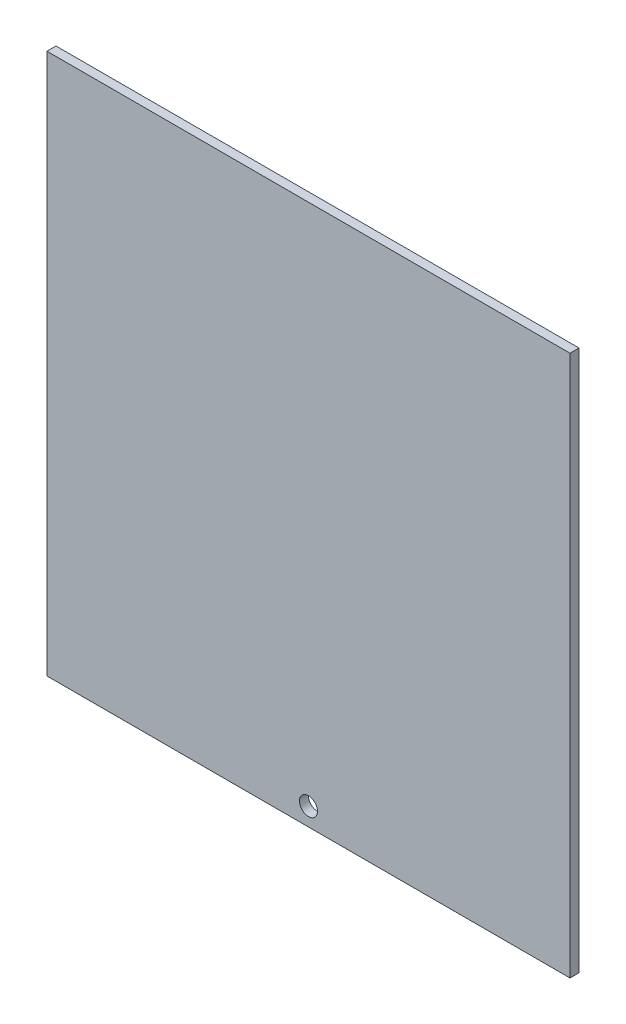
ISO-10303-21;
HEADER;
FILE_DESCRIPTION(('STEP AP214'),'2;1');
FILE_NAME('part.step','',(''),(''),'','','');
FILE_SCHEMA(('AUTOMOTIVE_DESIGN { 1 0 10303 214 1 1 1 1 }'));
ENDSEC;
DATA;
#1=APPLICATION_CONTEXT('core data for automotive mechanical design processes');
#2=APPLICATION_PROTOCOL_DEFINITION('international standard','automotive_design',2000,#1);
#3=PRODUCT_CONTEXT('',#1,'mechanical');
#4=PRODUCT('Part','Part','',(#3));
#5=PRODUCT_RELATED_PRODUCT_CATEGORY('part','',(#4));
#6=PRODUCT_DEFINITION_FORMATION('','',#4);
#7=PRODUCT_DEFINITION_CONTEXT('part definition',#1,'design');
#8=PRODUCT_DEFINITION('design','',#6,#7);
#9=PRODUCT_DEFINITION_SHAPE('','',#8);
#10=(LENGTH_UNIT() NAMED_UNIT(*) SI_UNIT(.MILLI.,.METRE.));
#11=(NAMED_UNIT(*) PLANE_ANGLE_UNIT() SI_UNIT($,.RADIAN.));
#12=(NAMED_UNIT(*) SI_UNIT($,.STERADIAN.) SOLID_ANGLE_UNIT());
#13=UNCERTAINTY_MEASURE_WITH_UNIT(LENGTH_MEASURE(1.E-05),#10,'distance_accuracy_value','');
#14=(GEOMETRIC_REPRESENTATION_CONTEXT(3) GLOBAL_UNCERTAINTY_ASSIGNED_CONTEXT((#13)) GLOBAL_UNIT_ASSIGNED_CONTEXT((#10,
#11,#12)) REPRESENTATION_CONTEXT('',''));
#15=CARTESIAN_POINT('',(0.,0.,0.));
#16=DIRECTION('',(0.,0.,1.));
#17=DIRECTION('',(1.,0.,0.));
#18=AXIS2_PLACEMENT_3D('',#15,#16,#17);
#19=CARTESIAN_POINT('',(0.,0.,0.));
#20=DIRECTION('',(0.,0.,-1.));
#21=DIRECTION('',(-1.,0.,0.));
#22=AXIS2_PLACEMENT_3D('',#19,#20,#21);
#23=PLANE('',#22);
#24=DIRECTION('',(0.,1.,0.));
#25=VECTOR('',#24,1.);
#26=CARTESIAN_POINT('',(290.,0.,0.));
#27=LINE('',#26,#25);
#28=CARTESIAN_POINT('',(290.,300.,0.));
#29=VERTEX_POINT('',#28);
#30=CARTESIAN_POINT('',(290.,0.,0.));
#31=VERTEX_POINT('',#30);
#32=EDGE_CURVE('E55',#29,#31,#27,.F.);
#33=ORIENTED_EDGE('',*,*,#32,.T.);
#34=DIRECTION('',(1.,0.,0.));
#35=VECTOR('',#34,1.);
#36=CARTESIAN_POINT('',(0.,0.,0.));
#37=LINE('',#36,#35);
#38=CARTESIAN_POINT('',(0.,0.,0.));
#39=VERTEX_POINT('',#38);
#40=EDGE_CURVE('E91',#31,#39,#37,.F.);
#41=ORIENTED_EDGE('',*,*,#40,.T.);
#42=DIRECTION('',(0.,1.,0.));
#43=VECTOR('',#42,1.);
#44=CARTESIAN_POINT('',(0.,0.,0.));
#45=LINE('',#44,#43);
#46=CARTESIAN_POINT('',(0.,300.,0.));
#47=VERTEX_POINT('',#46);
#48=EDGE_CURVE('E60',#39,#47,#45,.T.);
#49=ORIENTED_EDGE('',*,*,#48,.T.);
#50=DIRECTION('',(1.,0.,0.));
#51=VECTOR('',#50,1.);
#52=CARTESIAN_POINT('',(0.,300.,0.));
#53=LINE('',#52,#51);
#54=EDGE_CURVE('E58',#47,#29,#53,.T.);
#55=ORIENTED_EDGE('',*,*,#54,.T.);
#56=EDGE_LOOP('',(#33,#41,#49,#55));
#57=FACE_BOUND('',#56,.T.);
#58=CARTESIAN_POINT('',(145.,10.,0.));
#59=DIRECTION('',(0.,0.,1.));
#60=DIRECTION('',(1.,0.,0.));
#61=AXIS2_PLACEMENT_3D('',#58,#59,#60);
#62=CIRCLE('',#61,4.99999999999998);
#63=CARTESIAN_POINT('',(150.,10.,0.));
#64=VERTEX_POINT('',#63);
#65=EDGE_CURVE('E20',#64,#64,#62,.T.);
#66=ORIENTED_EDGE('',*,*,#65,.T.);
#67=EDGE_LOOP('',(#66));
#68=FACE_BOUND('',#67,.T.);
#69=ADVANCED_FACE('F17',(#57,#68),#23,.T.);
#70=CARTESIAN_POINT('',(145.,10.,-5.));
#71=DIRECTION('',(0.,0.,1.));
#72=DIRECTION('',(1.,0.,0.));
#73=AXIS2_PLACEMENT_3D('',#70,#71,#72);
#74=CYLINDRICAL_SURFACE('',#73,4.99999999999998);
#75=ORIENTED_EDGE('',*,*,#65,.F.);
#76=EDGE_LOOP('',(#75));
#77=FACE_BOUND('',#76,.T.);
#78=CARTESIAN_POINT('',(145.,10.,5.));
#79=DIRECTION('',(0.,0.,1.));
#80=DIRECTION('',(1.,0.,0.));
#81=AXIS2_PLACEMENT_3D('',#78,#79,#80);
#82=CIRCLE('',#81,4.99999999999998);
#83=CARTESIAN_POINT('',(150.,10.,5.));
#84=VERTEX_POINT('',#83);
#85=EDGE_CURVE('E79',#84,#84,#82,.T.);
#86=ORIENTED_EDGE('',*,*,#85,.T.);
#87=EDGE_LOOP('',(#86));
#88=FACE_BOUND('',#87,.T.);
#89=ADVANCED_FACE('F114',(#77,#88),#74,.F.);
#90=CARTESIAN_POINT('',(0.,300.,5.));
#91=DIRECTION('',(0.,-1.,0.));
#92=DIRECTION('',(0.,0.,-1.));
#93=AXIS2_PLACEMENT_3D('',#90,#91,#92);
#94=PLANE('',#93);
#95=DIRECTION('',(0.,0.,-1.));
#96=VECTOR('',#95,1.);
#97=CARTESIAN_POINT('',(0.,300.,5.));
#98=LINE('',#97,#96);
#99=CARTESIAN_POINT('',(0.,300.,5.));
#100=VERTEX_POINT('',#99);
#101=EDGE_CURVE('E86',#47,#100,#98,.F.);
#102=ORIENTED_EDGE('',*,*,#101,.T.);
#103=DIRECTION('',(-1.,0.,0.));
#104=VECTOR('',#103,1.);
#105=CARTESIAN_POINT('',(0.,300.,5.));
#106=LINE('',#105,#104);
#107=CARTESIAN_POINT('',(290.,300.,5.));
#108=VERTEX_POINT('',#107);
#109=EDGE_CURVE('E76',#100,#108,#106,.F.);
#110=ORIENTED_EDGE('',*,*,#109,.T.);
#111=DIRECTION('',(0.,0.,1.));
#112=VECTOR('',#111,1.);
#113=CARTESIAN_POINT('',(290.,300.,5.));
#114=LINE('',#113,#112);
#115=EDGE_CURVE('E65',#108,#29,#114,.F.);
#116=ORIENTED_EDGE('',*,*,#115,.T.);
#117=ORIENTED_EDGE('',*,*,#54,.F.);
#118=EDGE_LOOP('',(#102,#110,#116,#117));
#119=FACE_BOUND('',#118,.T.);
#120=ADVANCED_FACE('F75',(#119),#94,.F.);
#121=CARTESIAN_POINT('',(290.,0.,5.));
#122=DIRECTION('',(-1.,0.,0.));
#123=DIRECTION('',(0.,0.,1.));
#124=AXIS2_PLACEMENT_3D('',#121,#122,#123);
#125=PLANE('',#124);
#126=ORIENTED_EDGE('',*,*,#115,.F.);
#127=DIRECTION('',(0.,1.,0.));
#128=VECTOR('',#127,1.);
#129=CARTESIAN_POINT('',(290.,0.,5.));
#130=LINE('',#129,#128);
#131=CARTESIAN_POINT('',(290.,0.,5.));
#132=VERTEX_POINT('',#131);
#133=EDGE_CURVE('E83',#108,#132,#130,.F.);
#134=ORIENTED_EDGE('',*,*,#133,.T.);
#135=DIRECTION('',(0.,0.,1.));
#136=VECTOR('',#135,1.);
#137=CARTESIAN_POINT('',(290.,0.,5.));
#138=LINE('',#137,#136);
#139=EDGE_CURVE('E72',#132,#31,#138,.F.);
#140=ORIENTED_EDGE('',*,*,#139,.T.);
#141=ORIENTED_EDGE('',*,*,#32,.F.);
#142=EDGE_LOOP('',(#126,#134,#140,#141));
#143=FACE_BOUND('',#142,.T.);
#144=ADVANCED_FACE('F69',(#143),#125,.F.);
#145=CARTESIAN_POINT('',(0.,0.,5.));
#146=DIRECTION('',(0.,1.,0.));
#147=DIRECTION('',(0.,0.,1.));
#148=AXIS2_PLACEMENT_3D('',#145,#146,#147);
#149=PLANE('',#148);
#150=ORIENTED_EDGE('',*,*,#139,.F.);
#151=DIRECTION('',(-1.,0.,0.));
#152=VECTOR('',#151,1.);
#153=CARTESIAN_POINT('',(0.,0.,5.));
#154=LINE('',#153,#152);
#155=CARTESIAN_POINT('',(0.,0.,5.));
#156=VERTEX_POINT('',#155);
#157=EDGE_CURVE('E26',#132,#156,#154,.T.);
#158=ORIENTED_EDGE('',*,*,#157,.T.);
#159=DIRECTION('',(0.,0.,-1.));
#160=VECTOR('',#159,1.);
#161=CARTESIAN_POINT('',(0.,0.,5.));
#162=LINE('',#161,#160);
#163=EDGE_CURVE('E34',#156,#39,#162,.T.);
#164=ORIENTED_EDGE('',*,*,#163,.T.);
#165=ORIENTED_EDGE('',*,*,#40,.F.);
#166=EDGE_LOOP('',(#150,#158,#164,#165));
#167=FACE_BOUND('',#166,.T.);
#168=ADVANCED_FACE('F95',(#167),#149,.F.);
#169=CARTESIAN_POINT('',(0.,0.,5.));
#170=DIRECTION('',(1.,0.,0.));
#171=DIRECTION('',(0.,0.,-1.));
#172=AXIS2_PLACEMENT_3D('',#169,#170,#171);
#173=PLANE('',#172);
#174=ORIENTED_EDGE('',*,*,#163,.F.);
#175=DIRECTION('',(0.,1.,0.));
#176=VECTOR('',#175,1.);
#177=CARTESIAN_POINT('',(0.,0.,5.));
#178=LINE('',#177,#176);
#179=EDGE_CURVE('E11',#156,#100,#178,.T.);
#180=ORIENTED_EDGE('',*,*,#179,.T.);
#181=ORIENTED_EDGE('',*,*,#101,.F.);
#182=ORIENTED_EDGE('',*,*,#48,.F.);
#183=EDGE_LOOP('',(#174,#180,#181,#182));
#184=FACE_BOUND('',#183,.T.);
#185=ADVANCED_FACE('F93',(#184),#173,.F.);
#186=CARTESIAN_POINT('',(0.,0.,5.));
#187=DIRECTION('',(0.,0.,-1.));
#188=DIRECTION('',(-1.,0.,0.));
#189=AXIS2_PLACEMENT_3D('',#186,#187,#188);
#190=PLANE('',#189);
#191=ORIENTED_EDGE('',*,*,#157,.F.);
#192=ORIENTED_EDGE('',*,*,#133,.F.);
#193=ORIENTED_EDGE('',*,*,#109,.F.);
#194=ORIENTED_EDGE('',*,*,#179,.F.);
#195=EDGE_LOOP('',(#191,#192,#193,#194));
#196=FACE_BOUND('',#195,.T.);
#197=ORIENTED_EDGE('',*,*,#85,.F.);
#198=EDGE_LOOP('',(#197));
#199=FACE_BOUND('',#198,.T.);
#200=ADVANCED_FACE('F99',(#196,#199),#190,.F.);
#201=CLOSED_SHELL('',(#69,#89,#120,#144,#168,#185,#200));
#202=MANIFOLD_SOLID_BREP('B1',#201);
#203=ADVANCED_BREP_SHAPE_REPRESENTATION('',(#18,#202),#14);
#204=SHAPE_DEFINITION_REPRESENTATION(#9,#203);
ENDSEC;
END-ISO-10303-21;
